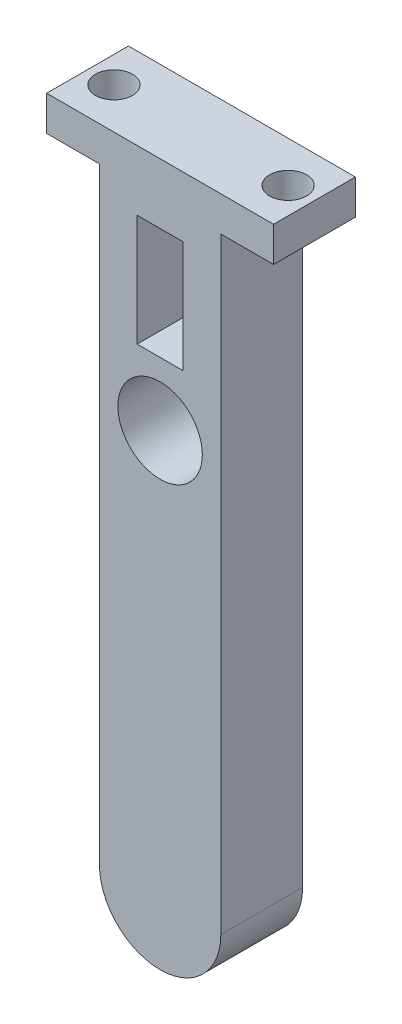
ISO-10303-21;
HEADER;
FILE_DESCRIPTION(('STEP AP214'),'2;1');
FILE_NAME('part.step','',(''),(''),'','','');
FILE_SCHEMA(('AUTOMOTIVE_DESIGN { 1 0 10303 214 1 1 1 1 }'));
ENDSEC;
DATA;
#1=APPLICATION_CONTEXT('core data for automotive mechanical design processes');
#2=APPLICATION_PROTOCOL_DEFINITION('international standard','automotive_design',2000,#1);
#3=PRODUCT_CONTEXT('',#1,'mechanical');
#4=PRODUCT('Part','Part','',(#3));
#5=PRODUCT_RELATED_PRODUCT_CATEGORY('part','',(#4));
#6=PRODUCT_DEFINITION_FORMATION('','',#4);
#7=PRODUCT_DEFINITION_CONTEXT('part definition',#1,'design');
#8=PRODUCT_DEFINITION('design','',#6,#7);
#9=PRODUCT_DEFINITION_SHAPE('','',#8);
#10=(LENGTH_UNIT() NAMED_UNIT(*) SI_UNIT(.MILLI.,.METRE.));
#11=(NAMED_UNIT(*) PLANE_ANGLE_UNIT() SI_UNIT($,.RADIAN.));
#12=(NAMED_UNIT(*) SI_UNIT($,.STERADIAN.) SOLID_ANGLE_UNIT());
#13=UNCERTAINTY_MEASURE_WITH_UNIT(LENGTH_MEASURE(1.E-05),#10,'distance_accuracy_value','');
#14=(GEOMETRIC_REPRESENTATION_CONTEXT(3) GLOBAL_UNCERTAINTY_ASSIGNED_CONTEXT((#13)) GLOBAL_UNIT_ASSIGNED_CONTEXT((#10,
#11,#12)) REPRESENTATION_CONTEXT('',''));
#15=CARTESIAN_POINT('',(0.,0.,0.));
#16=DIRECTION('',(0.,0.,1.));
#17=DIRECTION('',(1.,0.,0.));
#18=AXIS2_PLACEMENT_3D('',#15,#16,#17);
#19=CARTESIAN_POINT('',(-51.1021307500794,-3.85905840286054,15.5));
#20=DIRECTION('',(0.,0.,1.));
#21=DIRECTION('',(1.,0.,0.));
#22=AXIS2_PLACEMENT_3D('',#19,#20,#21);
#23=PLANE('',#22);
#24=CARTESIAN_POINT('',(-51.1021307500794,73.1409415971395,15.5));
#25=DIRECTION('',(0.,0.,1.));
#26=DIRECTION('',(1.,0.,0.));
#27=AXIS2_PLACEMENT_3D('',#24,#25,#26);
#28=CIRCLE('',#27,8.);
#29=CARTESIAN_POINT('',(-43.1021307500794,73.1409415971395,15.5));
#30=VERTEX_POINT('',#29);
#31=EDGE_CURVE('E161',#30,#30,#28,.T.);
#32=ORIENTED_EDGE('',*,*,#31,.F.);
#33=EDGE_LOOP('',(#32));
#34=FACE_BOUND('',#33,.T.);
#35=CARTESIAN_POINT('',(-51.1021307500794,-3.85905840286054,15.5));
#36=DIRECTION('',(0.,0.,1.));
#37=DIRECTION('',(1.,0.,0.));
#38=AXIS2_PLACEMENT_3D('',#35,#36,#37);
#39=CIRCLE('',#38,11.5);
#40=CARTESIAN_POINT('',(-62.6021307500794,-3.85905840286054,15.5));
#41=VERTEX_POINT('',#40);
#42=CARTESIAN_POINT('',(-39.6021307500794,-3.85905840286054,15.5));
#43=VERTEX_POINT('',#42);
#44=EDGE_CURVE('E167',#41,#43,#39,.T.);
#45=ORIENTED_EDGE('',*,*,#44,.T.);
#46=DIRECTION('',(0.,-1.,0.));
#47=VECTOR('',#46,1.);
#48=CARTESIAN_POINT('',(-39.6021307500794,111.140941597139,15.5));
#49=LINE('',#48,#47);
#50=CARTESIAN_POINT('',(-39.6021307500794,111.140941597139,15.5));
#51=VERTEX_POINT('',#50);
#52=EDGE_CURVE('E169',#51,#43,#49,.T.);
#53=ORIENTED_EDGE('',*,*,#52,.F.);
#54=DIRECTION('',(-1.,0.,0.));
#55=VECTOR('',#54,1.);
#56=CARTESIAN_POINT('',(-29.6021307500794,111.140941597139,15.5));
#57=LINE('',#56,#55);
#58=CARTESIAN_POINT('',(-29.6021307500794,111.140941597139,15.5));
#59=VERTEX_POINT('',#58);
#60=EDGE_CURVE('E173',#59,#51,#57,.T.);
#61=ORIENTED_EDGE('',*,*,#60,.F.);
#62=DIRECTION('',(0.,-1.,0.));
#63=VECTOR('',#62,1.);
#64=CARTESIAN_POINT('',(-29.6021307500794,117.740941597139,15.5));
#65=LINE('',#64,#63);
#66=CARTESIAN_POINT('',(-29.6021307500794,117.740941597139,15.5));
#67=VERTEX_POINT('',#66);
#68=EDGE_CURVE('E176',#67,#59,#65,.T.);
#69=ORIENTED_EDGE('',*,*,#68,.F.);
#70=DIRECTION('',(1.,0.,0.));
#71=VECTOR('',#70,1.);
#72=CARTESIAN_POINT('',(-72.6021307500794,117.740941597139,15.5));
#73=LINE('',#72,#71);
#74=CARTESIAN_POINT('',(-72.6021307500794,117.740941597139,15.5));
#75=VERTEX_POINT('',#74);
#76=EDGE_CURVE('E179',#75,#67,#73,.T.);
#77=ORIENTED_EDGE('',*,*,#76,.F.);
#78=DIRECTION('',(0.,1.,0.));
#79=VECTOR('',#78,1.);
#80=CARTESIAN_POINT('',(-72.6021307500794,111.140941597139,15.5));
#81=LINE('',#80,#79);
#82=CARTESIAN_POINT('',(-72.6021307500794,111.140941597139,15.5));
#83=VERTEX_POINT('',#82);
#84=EDGE_CURVE('E182',#83,#75,#81,.T.);
#85=ORIENTED_EDGE('',*,*,#84,.F.);
#86=DIRECTION('',(-1.,0.,0.));
#87=VECTOR('',#86,1.);
#88=CARTESIAN_POINT('',(-62.6021307500794,111.140941597139,15.5));
#89=LINE('',#88,#87);
#90=CARTESIAN_POINT('',(-62.6021307500794,111.140941597139,15.5));
#91=VERTEX_POINT('',#90);
#92=EDGE_CURVE('E185',#91,#83,#89,.T.);
#93=ORIENTED_EDGE('',*,*,#92,.F.);
#94=DIRECTION('',(0.,1.,0.));
#95=VECTOR('',#94,1.);
#96=CARTESIAN_POINT('',(-62.6021307500794,-3.85905840286054,15.5));
#97=LINE('',#96,#95);
#98=EDGE_CURVE('E188',#41,#91,#97,.T.);
#99=ORIENTED_EDGE('',*,*,#98,.F.);
#100=EDGE_LOOP('',(#45,#53,#61,#69,#77,#85,#93,#99));
#101=FACE_BOUND('',#100,.T.);
#102=DIRECTION('',(1.,0.,0.));
#103=VECTOR('',#102,1.);
#104=CARTESIAN_POINT('',(-55.4521307500794,85.1409415971395,15.5));
#105=LINE('',#104,#103);
#106=CARTESIAN_POINT('',(-55.4521307500794,85.1409415971395,15.5));
#107=VERTEX_POINT('',#106);
#108=CARTESIAN_POINT('',(-46.7521307500794,85.1409415971395,15.5));
#109=VERTEX_POINT('',#108);
#110=EDGE_CURVE('E133',#107,#109,#105,.T.);
#111=ORIENTED_EDGE('',*,*,#110,.F.);
#112=DIRECTION('',(0.,-1.,0.));
#113=VECTOR('',#112,1.);
#114=CARTESIAN_POINT('',(-55.4521307500794,106.287384573463,15.5));
#115=LINE('',#114,#113);
#116=CARTESIAN_POINT('',(-55.4521307500794,106.287384573463,15.5));
#117=VERTEX_POINT('',#116);
#118=EDGE_CURVE('E124',#117,#107,#115,.T.);
#119=ORIENTED_EDGE('',*,*,#118,.F.);
#120=DIRECTION('',(1.,0.,0.));
#121=VECTOR('',#120,1.);
#122=CARTESIAN_POINT('',(-55.4521307500794,106.287384573463,15.5));
#123=LINE('',#122,#121);
#124=CARTESIAN_POINT('',(-46.7521307500794,106.287384573463,15.5));
#125=VERTEX_POINT('',#124);
#126=EDGE_CURVE('E144',#117,#125,#123,.T.);
#127=ORIENTED_EDGE('',*,*,#126,.T.);
#128=DIRECTION('',(0.,-1.,0.));
#129=VECTOR('',#128,1.);
#130=CARTESIAN_POINT('',(-46.7521307500794,106.287384573463,15.5));
#131=LINE('',#130,#129);
#132=EDGE_CURVE('E51',#125,#109,#131,.T.);
#133=ORIENTED_EDGE('',*,*,#132,.T.);
#134=EDGE_LOOP('',(#111,#119,#127,#133));
#135=FACE_BOUND('',#134,.T.);
#136=ADVANCED_FACE('F36',(#34,#101,#135),#23,.T.);
#137=CARTESIAN_POINT('',(-51.1021307500794,-3.85905840286054,0.));
#138=DIRECTION('',(0.,0.,1.));
#139=DIRECTION('',(1.,0.,0.));
#140=AXIS2_PLACEMENT_3D('',#137,#138,#139);
#141=PLANE('',#140);
#142=CARTESIAN_POINT('',(-51.1021307500794,-3.85905840286054,0.));
#143=DIRECTION('',(0.,0.,1.));
#144=DIRECTION('',(1.,0.,0.));
#145=AXIS2_PLACEMENT_3D('',#142,#143,#144);
#146=CIRCLE('',#145,11.5);
#147=CARTESIAN_POINT('',(-62.6021307500794,-3.85905840286054,0.));
#148=VERTEX_POINT('',#147);
#149=CARTESIAN_POINT('',(-39.6021307500794,-3.85905840286054,0.));
#150=VERTEX_POINT('',#149);
#151=EDGE_CURVE('E164',#148,#150,#146,.T.);
#152=ORIENTED_EDGE('',*,*,#151,.F.);
#153=DIRECTION('',(0.,1.,0.));
#154=VECTOR('',#153,1.);
#155=CARTESIAN_POINT('',(-62.6021307500794,-3.85905840286054,0.));
#156=LINE('',#155,#154);
#157=CARTESIAN_POINT('',(-62.6021307500794,111.140941597139,0.));
#158=VERTEX_POINT('',#157);
#159=EDGE_CURVE('E170',#148,#158,#156,.T.);
#160=ORIENTED_EDGE('',*,*,#159,.T.);
#161=DIRECTION('',(-1.,0.,0.));
#162=VECTOR('',#161,1.);
#163=CARTESIAN_POINT('',(-62.6021307500794,111.140941597139,0.));
#164=LINE('',#163,#162);
#165=CARTESIAN_POINT('',(-72.6021307500794,111.140941597139,0.));
#166=VERTEX_POINT('',#165);
#167=EDGE_CURVE('E209',#158,#166,#164,.T.);
#168=ORIENTED_EDGE('',*,*,#167,.T.);
#169=DIRECTION('',(0.,1.,0.));
#170=VECTOR('',#169,1.);
#171=CARTESIAN_POINT('',(-72.6021307500794,111.140941597139,0.));
#172=LINE('',#171,#170);
#173=CARTESIAN_POINT('',(-72.6021307500794,117.740941597139,0.));
#174=VERTEX_POINT('',#173);
#175=EDGE_CURVE('E206',#166,#174,#172,.T.);
#176=ORIENTED_EDGE('',*,*,#175,.T.);
#177=DIRECTION('',(1.,0.,0.));
#178=VECTOR('',#177,1.);
#179=CARTESIAN_POINT('',(-72.6021307500794,117.740941597139,0.));
#180=LINE('',#179,#178);
#181=CARTESIAN_POINT('',(-29.6021307500794,117.740941597139,0.));
#182=VERTEX_POINT('',#181);
#183=EDGE_CURVE('E203',#174,#182,#180,.T.);
#184=ORIENTED_EDGE('',*,*,#183,.T.);
#185=DIRECTION('',(0.,-1.,0.));
#186=VECTOR('',#185,1.);
#187=CARTESIAN_POINT('',(-29.6021307500794,117.740941597139,0.));
#188=LINE('',#187,#186);
#189=CARTESIAN_POINT('',(-29.6021307500794,111.140941597139,0.));
#190=VERTEX_POINT('',#189);
#191=EDGE_CURVE('E200',#182,#190,#188,.T.);
#192=ORIENTED_EDGE('',*,*,#191,.T.);
#193=DIRECTION('',(-1.,0.,0.));
#194=VECTOR('',#193,1.);
#195=CARTESIAN_POINT('',(-29.6021307500794,111.140941597139,0.));
#196=LINE('',#195,#194);
#197=CARTESIAN_POINT('',(-39.6021307500794,111.140941597139,0.));
#198=VERTEX_POINT('',#197);
#199=EDGE_CURVE('E197',#190,#198,#196,.T.);
#200=ORIENTED_EDGE('',*,*,#199,.T.);
#201=DIRECTION('',(0.,-1.,0.));
#202=VECTOR('',#201,1.);
#203=CARTESIAN_POINT('',(-39.6021307500794,111.140941597139,0.));
#204=LINE('',#203,#202);
#205=EDGE_CURVE('E194',#198,#150,#204,.T.);
#206=ORIENTED_EDGE('',*,*,#205,.T.);
#207=EDGE_LOOP('',(#152,#160,#168,#176,#184,#192,#200,#206));
#208=FACE_BOUND('',#207,.T.);
#209=CARTESIAN_POINT('',(-51.1021307500794,73.1409415971395,0.));
#210=DIRECTION('',(0.,0.,1.));
#211=DIRECTION('',(1.,0.,0.));
#212=AXIS2_PLACEMENT_3D('',#209,#210,#211);
#213=CIRCLE('',#212,8.);
#214=CARTESIAN_POINT('',(-43.1021307500794,73.1409415971395,0.));
#215=VERTEX_POINT('',#214);
#216=EDGE_CURVE('E140',#215,#215,#213,.T.);
#217=ORIENTED_EDGE('',*,*,#216,.T.);
#218=EDGE_LOOP('',(#217));
#219=FACE_BOUND('',#218,.T.);
#220=DIRECTION('',(0.,-1.,0.));
#221=VECTOR('',#220,1.);
#222=CARTESIAN_POINT('',(-55.4521307500794,106.287384573463,0.));
#223=LINE('',#222,#221);
#224=CARTESIAN_POINT('',(-55.4521307500794,106.287384573463,0.));
#225=VERTEX_POINT('',#224);
#226=CARTESIAN_POINT('',(-55.4521307500794,85.1409415971395,0.));
#227=VERTEX_POINT('',#226);
#228=EDGE_CURVE('E59',#225,#227,#223,.T.);
#229=ORIENTED_EDGE('',*,*,#228,.T.);
#230=DIRECTION('',(1.,0.,0.));
#231=VECTOR('',#230,1.);
#232=CARTESIAN_POINT('',(-55.4521307500794,85.1409415971395,0.));
#233=LINE('',#232,#231);
#234=CARTESIAN_POINT('',(-46.7521307500794,85.1409415971395,0.));
#235=VERTEX_POINT('',#234);
#236=EDGE_CURVE('E139',#227,#235,#233,.T.);
#237=ORIENTED_EDGE('',*,*,#236,.T.);
#238=DIRECTION('',(0.,-1.,0.));
#239=VECTOR('',#238,1.);
#240=CARTESIAN_POINT('',(-46.7521307500794,106.287384573463,0.));
#241=LINE('',#240,#239);
#242=CARTESIAN_POINT('',(-46.7521307500794,106.287384573463,0.));
#243=VERTEX_POINT('',#242);
#244=EDGE_CURVE('E152',#243,#235,#241,.T.);
#245=ORIENTED_EDGE('',*,*,#244,.F.);
#246=DIRECTION('',(1.,0.,0.));
#247=VECTOR('',#246,1.);
#248=CARTESIAN_POINT('',(-55.4521307500794,106.287384573463,0.));
#249=LINE('',#248,#247);
#250=EDGE_CURVE('E134',#225,#243,#249,.T.);
#251=ORIENTED_EDGE('',*,*,#250,.F.);
#252=EDGE_LOOP('',(#229,#237,#245,#251));
#253=FACE_BOUND('',#252,.T.);
#254=ADVANCED_FACE('F235',(#208,#219,#253),#141,.F.);
#255=CARTESIAN_POINT('',(-51.1021307500794,-3.85905840286054,15.5));
#256=DIRECTION('',(0.,0.,-1.));
#257=DIRECTION('',(-1.,0.,0.));
#258=AXIS2_PLACEMENT_3D('',#255,#256,#257);
#259=CYLINDRICAL_SURFACE('',#258,11.5);
#260=ORIENTED_EDGE('',*,*,#151,.T.);
#261=DIRECTION('',(0.,0.,-1.));
#262=VECTOR('',#261,1.);
#263=CARTESIAN_POINT('',(-39.6021307500794,-3.85905840286054,15.5));
#264=LINE('',#263,#262);
#265=EDGE_CURVE('E11',#43,#150,#264,.T.);
#266=ORIENTED_EDGE('',*,*,#265,.F.);
#267=ORIENTED_EDGE('',*,*,#44,.F.);
#268=DIRECTION('',(0.,0.,-1.));
#269=VECTOR('',#268,1.);
#270=CARTESIAN_POINT('',(-62.6021307500794,-3.85905840286054,15.5));
#271=LINE('',#270,#269);
#272=EDGE_CURVE('E191',#41,#148,#271,.T.);
#273=ORIENTED_EDGE('',*,*,#272,.T.);
#274=EDGE_LOOP('',(#260,#266,#267,#273));
#275=FACE_BOUND('',#274,.T.);
#276=ADVANCED_FACE('F38',(#275),#259,.T.);
#277=CARTESIAN_POINT('',(-39.6021307500794,111.140941597139,15.5));
#278=DIRECTION('',(1.,0.,0.));
#279=DIRECTION('',(0.,1.,0.));
#280=AXIS2_PLACEMENT_3D('',#277,#278,#279);
#281=PLANE('',#280);
#282=ORIENTED_EDGE('',*,*,#205,.F.);
#283=DIRECTION('',(0.,0.,-1.));
#284=VECTOR('',#283,1.);
#285=CARTESIAN_POINT('',(-39.6021307500794,111.140941597139,15.5));
#286=LINE('',#285,#284);
#287=EDGE_CURVE('E44',#51,#198,#286,.T.);
#288=ORIENTED_EDGE('',*,*,#287,.F.);
#289=ORIENTED_EDGE('',*,*,#52,.T.);
#290=ORIENTED_EDGE('',*,*,#265,.T.);
#291=EDGE_LOOP('',(#282,#288,#289,#290));
#292=FACE_BOUND('',#291,.T.);
#293=ADVANCED_FACE('F231',(#292),#281,.T.);
#294=CARTESIAN_POINT('',(-29.6021307500794,111.140941597139,15.5));
#295=DIRECTION('',(0.,-1.,0.));
#296=DIRECTION('',(0.,0.,-1.));
#297=AXIS2_PLACEMENT_3D('',#294,#295,#296);
#298=PLANE('',#297);
#299=CARTESIAN_POINT('',(-34.6021307500795,111.140941597139,7.75));
#300=DIRECTION('',(0.,-1.,0.));
#301=DIRECTION('',(0.,0.,-1.));
#302=AXIS2_PLACEMENT_3D('',#299,#300,#301);
#303=CIRCLE('',#302,3.5);
#304=CARTESIAN_POINT('',(-34.6021307500795,111.140941597139,4.25));
#305=VERTEX_POINT('',#304);
#306=EDGE_CURVE('E295',#305,#305,#303,.T.);
#307=ORIENTED_EDGE('',*,*,#306,.F.);
#308=EDGE_LOOP('',(#307));
#309=FACE_BOUND('',#308,.T.);
#310=ORIENTED_EDGE('',*,*,#199,.F.);
#311=DIRECTION('',(0.,0.,-1.));
#312=VECTOR('',#311,1.);
#313=CARTESIAN_POINT('',(-29.6021307500794,111.140941597139,15.5));
#314=LINE('',#313,#312);
#315=EDGE_CURVE('E223',#59,#190,#314,.T.);
#316=ORIENTED_EDGE('',*,*,#315,.F.);
#317=ORIENTED_EDGE('',*,*,#60,.T.);
#318=ORIENTED_EDGE('',*,*,#287,.T.);
#319=EDGE_LOOP('',(#310,#316,#317,#318));
#320=FACE_BOUND('',#319,.T.);
#321=ADVANCED_FACE('F227',(#309,#320),#298,.T.);
#322=CARTESIAN_POINT('',(-29.6021307500794,117.740941597139,15.5));
#323=DIRECTION('',(1.,0.,0.));
#324=DIRECTION('',(0.,0.,-1.));
#325=AXIS2_PLACEMENT_3D('',#322,#323,#324);
#326=PLANE('',#325);
#327=ORIENTED_EDGE('',*,*,#191,.F.);
#328=DIRECTION('',(0.,0.,-1.));
#329=VECTOR('',#328,1.);
#330=CARTESIAN_POINT('',(-29.6021307500794,117.740941597139,15.5));
#331=LINE('',#330,#329);
#332=EDGE_CURVE('E221',#67,#182,#331,.T.);
#333=ORIENTED_EDGE('',*,*,#332,.F.);
#334=ORIENTED_EDGE('',*,*,#68,.T.);
#335=ORIENTED_EDGE('',*,*,#315,.T.);
#336=EDGE_LOOP('',(#327,#333,#334,#335));
#337=FACE_BOUND('',#336,.T.);
#338=ADVANCED_FACE('F240',(#337),#326,.T.);
#339=CARTESIAN_POINT('',(-72.6021307500794,117.740941597139,15.5));
#340=DIRECTION('',(0.,1.,0.));
#341=DIRECTION('',(0.,0.,1.));
#342=AXIS2_PLACEMENT_3D('',#339,#340,#341);
#343=PLANE('',#342);
#344=CARTESIAN_POINT('',(-67.6021307500795,117.740941597139,7.75));
#345=DIRECTION('',(0.,-1.,0.));
#346=DIRECTION('',(0.,0.,-1.));
#347=AXIS2_PLACEMENT_3D('',#344,#345,#346);
#348=CIRCLE('',#347,3.50000000000001);
#349=CARTESIAN_POINT('',(-67.6021307500795,117.740941597139,4.24999999999999));
#350=VERTEX_POINT('',#349);
#351=EDGE_CURVE('E293',#350,#350,#348,.T.);
#352=ORIENTED_EDGE('',*,*,#351,.T.);
#353=EDGE_LOOP('',(#352));
#354=FACE_BOUND('',#353,.T.);
#355=CARTESIAN_POINT('',(-34.6021307500795,117.740941597139,7.75));
#356=DIRECTION('',(0.,-1.,0.));
#357=DIRECTION('',(0.,0.,-1.));
#358=AXIS2_PLACEMENT_3D('',#355,#356,#357);
#359=CIRCLE('',#358,3.5);
#360=CARTESIAN_POINT('',(-34.6021307500795,117.740941597139,4.25));
#361=VERTEX_POINT('',#360);
#362=EDGE_CURVE('E150',#361,#361,#359,.T.);
#363=ORIENTED_EDGE('',*,*,#362,.T.);
#364=EDGE_LOOP('',(#363));
#365=FACE_BOUND('',#364,.T.);
#366=ORIENTED_EDGE('',*,*,#183,.F.);
#367=DIRECTION('',(0.,0.,-1.));
#368=VECTOR('',#367,1.);
#369=CARTESIAN_POINT('',(-72.6021307500794,117.740941597139,15.5));
#370=LINE('',#369,#368);
#371=EDGE_CURVE('E219',#75,#174,#370,.T.);
#372=ORIENTED_EDGE('',*,*,#371,.F.);
#373=ORIENTED_EDGE('',*,*,#76,.T.);
#374=ORIENTED_EDGE('',*,*,#332,.T.);
#375=EDGE_LOOP('',(#366,#372,#373,#374));
#376=FACE_BOUND('',#375,.T.);
#377=ADVANCED_FACE('F259',(#354,#365,#376),#343,.T.);
#378=CARTESIAN_POINT('',(-72.6021307500794,111.140941597139,15.5));
#379=DIRECTION('',(-1.,0.,0.));
#380=DIRECTION('',(0.,0.,1.));
#381=AXIS2_PLACEMENT_3D('',#378,#379,#380);
#382=PLANE('',#381);
#383=ORIENTED_EDGE('',*,*,#175,.F.);
#384=DIRECTION('',(0.,0.,-1.));
#385=VECTOR('',#384,1.);
#386=CARTESIAN_POINT('',(-72.6021307500794,111.140941597139,15.5));
#387=LINE('',#386,#385);
#388=EDGE_CURVE('E217',#83,#166,#387,.T.);
#389=ORIENTED_EDGE('',*,*,#388,.F.);
#390=ORIENTED_EDGE('',*,*,#84,.T.);
#391=ORIENTED_EDGE('',*,*,#371,.T.);
#392=EDGE_LOOP('',(#383,#389,#390,#391));
#393=FACE_BOUND('',#392,.T.);
#394=ADVANCED_FACE('F256',(#393),#382,.T.);
#395=CARTESIAN_POINT('',(-62.6021307500794,111.140941597139,15.5));
#396=DIRECTION('',(0.,-1.,0.));
#397=DIRECTION('',(0.,0.,-1.));
#398=AXIS2_PLACEMENT_3D('',#395,#396,#397);
#399=PLANE('',#398);
#400=CARTESIAN_POINT('',(-67.6021307500795,111.140941597139,7.75));
#401=DIRECTION('',(0.,-1.,0.));
#402=DIRECTION('',(0.,0.,-1.));
#403=AXIS2_PLACEMENT_3D('',#400,#401,#402);
#404=CIRCLE('',#403,3.50000000000001);
#405=CARTESIAN_POINT('',(-67.6021307500795,111.140941597139,4.24999999999999));
#406=VERTEX_POINT('',#405);
#407=EDGE_CURVE('E291',#406,#406,#404,.T.);
#408=ORIENTED_EDGE('',*,*,#407,.F.);
#409=EDGE_LOOP('',(#408));
#410=FACE_BOUND('',#409,.T.);
#411=ORIENTED_EDGE('',*,*,#167,.F.);
#412=DIRECTION('',(0.,0.,-1.));
#413=VECTOR('',#412,1.);
#414=CARTESIAN_POINT('',(-62.6021307500794,111.140941597139,15.5));
#415=LINE('',#414,#413);
#416=EDGE_CURVE('E215',#91,#158,#415,.T.);
#417=ORIENTED_EDGE('',*,*,#416,.F.);
#418=ORIENTED_EDGE('',*,*,#92,.T.);
#419=ORIENTED_EDGE('',*,*,#388,.T.);
#420=EDGE_LOOP('',(#411,#417,#418,#419));
#421=FACE_BOUND('',#420,.T.);
#422=ADVANCED_FACE('F253',(#410,#421),#399,.T.);
#423=CARTESIAN_POINT('',(-62.6021307500794,-3.85905840286054,15.5));
#424=DIRECTION('',(-1.,0.,0.));
#425=DIRECTION('',(0.,0.,1.));
#426=AXIS2_PLACEMENT_3D('',#423,#424,#425);
#427=PLANE('',#426);
#428=ORIENTED_EDGE('',*,*,#159,.F.);
#429=ORIENTED_EDGE('',*,*,#272,.F.);
#430=ORIENTED_EDGE('',*,*,#98,.T.);
#431=ORIENTED_EDGE('',*,*,#416,.T.);
#432=EDGE_LOOP('',(#428,#429,#430,#431));
#433=FACE_BOUND('',#432,.T.);
#434=ADVANCED_FACE('F250',(#433),#427,.T.);
#435=CARTESIAN_POINT('',(-51.1021307500794,73.1409415971395,15.5));
#436=DIRECTION('',(0.,0.,-1.));
#437=DIRECTION('',(-1.,0.,0.));
#438=AXIS2_PLACEMENT_3D('',#435,#436,#437);
#439=CYLINDRICAL_SURFACE('',#438,8.);
#440=ORIENTED_EDGE('',*,*,#31,.T.);
#441=EDGE_LOOP('',(#440));
#442=FACE_BOUND('',#441,.T.);
#443=ORIENTED_EDGE('',*,*,#216,.F.);
#444=EDGE_LOOP('',(#443));
#445=FACE_BOUND('',#444,.T.);
#446=ADVANCED_FACE('F280',(#442,#445),#439,.F.);
#447=CARTESIAN_POINT('',(-55.4521307500794,106.287384573463,15.5));
#448=DIRECTION('',(1.,0.,0.));
#449=DIRECTION('',(0.,0.,-1.));
#450=AXIS2_PLACEMENT_3D('',#447,#448,#449);
#451=PLANE('',#450);
#452=ORIENTED_EDGE('',*,*,#228,.F.);
#453=DIRECTION('',(0.,0.,-1.));
#454=VECTOR('',#453,1.);
#455=CARTESIAN_POINT('',(-55.4521307500794,106.287384573463,15.5));
#456=LINE('',#455,#454);
#457=EDGE_CURVE('E128',#117,#225,#456,.T.);
#458=ORIENTED_EDGE('',*,*,#457,.F.);
#459=ORIENTED_EDGE('',*,*,#118,.T.);
#460=DIRECTION('',(0.,0.,-1.));
#461=VECTOR('',#460,1.);
#462=CARTESIAN_POINT('',(-55.4521307500794,85.1409415971395,15.5));
#463=LINE('',#462,#461);
#464=EDGE_CURVE('E127',#107,#227,#463,.T.);
#465=ORIENTED_EDGE('',*,*,#464,.T.);
#466=EDGE_LOOP('',(#452,#458,#459,#465));
#467=FACE_BOUND('',#466,.T.);
#468=ADVANCED_FACE('F126',(#467),#451,.T.);
#469=CARTESIAN_POINT('',(-55.4521307500794,85.1409415971395,15.5));
#470=DIRECTION('',(0.,1.,0.));
#471=DIRECTION('',(0.,0.,1.));
#472=AXIS2_PLACEMENT_3D('',#469,#470,#471);
#473=PLANE('',#472);
#474=ORIENTED_EDGE('',*,*,#236,.F.);
#475=ORIENTED_EDGE('',*,*,#464,.F.);
#476=ORIENTED_EDGE('',*,*,#110,.T.);
#477=DIRECTION('',(0.,0.,-1.));
#478=VECTOR('',#477,1.);
#479=CARTESIAN_POINT('',(-46.7521307500794,85.1409415971395,15.5));
#480=LINE('',#479,#478);
#481=EDGE_CURVE('E141',#109,#235,#480,.T.);
#482=ORIENTED_EDGE('',*,*,#481,.T.);
#483=EDGE_LOOP('',(#474,#475,#476,#482));
#484=FACE_BOUND('',#483,.T.);
#485=ADVANCED_FACE('F137',(#484),#473,.T.);
#486=CARTESIAN_POINT('',(-46.7521307500794,106.287384573463,15.5));
#487=DIRECTION('',(1.,0.,0.));
#488=DIRECTION('',(0.,1.,0.));
#489=AXIS2_PLACEMENT_3D('',#486,#487,#488);
#490=PLANE('',#489);
#491=ORIENTED_EDGE('',*,*,#244,.T.);
#492=ORIENTED_EDGE('',*,*,#481,.F.);
#493=ORIENTED_EDGE('',*,*,#132,.F.);
#494=DIRECTION('',(0.,0.,-1.));
#495=VECTOR('',#494,1.);
#496=CARTESIAN_POINT('',(-46.7521307500794,106.287384573463,15.5));
#497=LINE('',#496,#495);
#498=EDGE_CURVE('E158',#125,#243,#497,.T.);
#499=ORIENTED_EDGE('',*,*,#498,.T.);
#500=EDGE_LOOP('',(#491,#492,#493,#499));
#501=FACE_BOUND('',#500,.T.);
#502=ADVANCED_FACE('F339',(#501),#490,.F.);
#503=CARTESIAN_POINT('',(-55.4521307500794,106.287384573463,15.5));
#504=DIRECTION('',(0.,1.,0.));
#505=DIRECTION('',(0.,0.,1.));
#506=AXIS2_PLACEMENT_3D('',#503,#504,#505);
#507=PLANE('',#506);
#508=ORIENTED_EDGE('',*,*,#250,.T.);
#509=ORIENTED_EDGE('',*,*,#498,.F.);
#510=ORIENTED_EDGE('',*,*,#126,.F.);
#511=ORIENTED_EDGE('',*,*,#457,.T.);
#512=EDGE_LOOP('',(#508,#509,#510,#511));
#513=FACE_BOUND('',#512,.T.);
#514=ADVANCED_FACE('F348',(#513),#507,.F.);
#515=CARTESIAN_POINT('',(-34.6021307500795,117.740941597139,7.75));
#516=DIRECTION('',(0.,-1.,0.));
#517=DIRECTION('',(0.,0.,-1.));
#518=AXIS2_PLACEMENT_3D('',#515,#516,#517);
#519=CYLINDRICAL_SURFACE('',#518,3.5);
#520=ORIENTED_EDGE('',*,*,#362,.F.);
#521=EDGE_LOOP('',(#520));
#522=FACE_BOUND('',#521,.T.);
#523=ORIENTED_EDGE('',*,*,#306,.T.);
#524=EDGE_LOOP('',(#523));
#525=FACE_BOUND('',#524,.T.);
#526=ADVANCED_FACE('F302',(#522,#525),#519,.F.);
#527=CARTESIAN_POINT('',(-67.6021307500795,117.740941597139,7.75));
#528=DIRECTION('',(0.,-1.,0.));
#529=DIRECTION('',(0.,0.,-1.));
#530=AXIS2_PLACEMENT_3D('',#527,#528,#529);
#531=CYLINDRICAL_SURFACE('',#530,3.50000000000001);
#532=ORIENTED_EDGE('',*,*,#351,.F.);
#533=EDGE_LOOP('',(#532));
#534=FACE_BOUND('',#533,.T.);
#535=ORIENTED_EDGE('',*,*,#407,.T.);
#536=EDGE_LOOP('',(#535));
#537=FACE_BOUND('',#536,.T.);
#538=ADVANCED_FACE('F371',(#534,#537),#531,.F.);
#539=CLOSED_SHELL('',(#136,#254,#276,#293,#321,#338,#377,#394,#422,#434,#446,#468,#485,#502,
#514,#526,#538));
#540=MANIFOLD_SOLID_BREP('B2',#539);
#541=ADVANCED_BREP_SHAPE_REPRESENTATION('',(#18,#540),#14);
#542=SHAPE_DEFINITION_REPRESENTATION(#9,#541);
ENDSEC;
END-ISO-10303-21;
